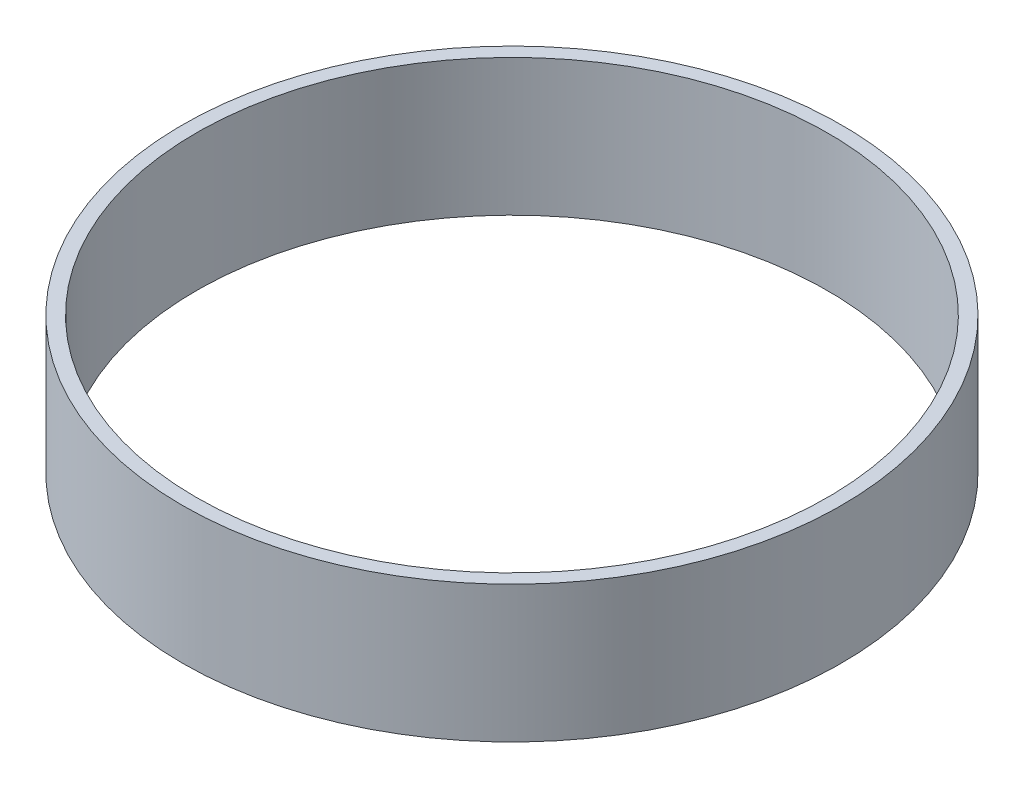
ISO-10303-21;
HEADER;
FILE_DESCRIPTION(('STEP AP214'),'2;1');
FILE_NAME('part.step','',(''),(''),'','','');
FILE_SCHEMA(('AUTOMOTIVE_DESIGN { 1 0 10303 214 1 1 1 1 }'));
ENDSEC;
DATA;
#1=APPLICATION_CONTEXT('core data for automotive mechanical design processes');
#2=APPLICATION_PROTOCOL_DEFINITION('international standard','automotive_design',2000,#1);
#3=PRODUCT_CONTEXT('',#1,'mechanical');
#4=PRODUCT('Part','Part','',(#3));
#5=PRODUCT_RELATED_PRODUCT_CATEGORY('part','',(#4));
#6=PRODUCT_DEFINITION_FORMATION('','',#4);
#7=PRODUCT_DEFINITION_CONTEXT('part definition',#1,'design');
#8=PRODUCT_DEFINITION('design','',#6,#7);
#9=PRODUCT_DEFINITION_SHAPE('','',#8);
#10=(LENGTH_UNIT() NAMED_UNIT(*) SI_UNIT(.MILLI.,.METRE.));
#11=(NAMED_UNIT(*) PLANE_ANGLE_UNIT() SI_UNIT($,.RADIAN.));
#12=(NAMED_UNIT(*) SI_UNIT($,.STERADIAN.) SOLID_ANGLE_UNIT());
#13=UNCERTAINTY_MEASURE_WITH_UNIT(LENGTH_MEASURE(1.E-05),#10,'distance_accuracy_value','');
#14=(GEOMETRIC_REPRESENTATION_CONTEXT(3) GLOBAL_UNCERTAINTY_ASSIGNED_CONTEXT((#13)) GLOBAL_UNIT_ASSIGNED_CONTEXT((#10,
#11,#12)) REPRESENTATION_CONTEXT('',''));
#15=CARTESIAN_POINT('',(0.,0.,0.));
#16=DIRECTION('',(0.,0.,1.));
#17=DIRECTION('',(1.,0.,0.));
#18=AXIS2_PLACEMENT_3D('',#15,#16,#17);
#19=CARTESIAN_POINT('',(-29.4584727390338,10.,1.69765412213674));
#20=DIRECTION('',(0.,1.,0.));
#21=DIRECTION('',(0.,0.,1.));
#22=AXIS2_PLACEMENT_3D('',#19,#20,#21);
#23=PLANE('',#22);
#24=CARTESIAN_POINT('',(-29.4584727390338,10.,1.69765412213674));
#25=DIRECTION('',(0.,1.,0.));
#26=DIRECTION('',(0.,0.,1.));
#27=AXIS2_PLACEMENT_3D('',#24,#25,#26);
#28=CIRCLE('',#27,24.116);
#29=CARTESIAN_POINT('',(-29.4584727390338,10.,25.8136541221367));
#30=VERTEX_POINT('',#29);
#31=EDGE_CURVE('E10',#30,#30,#28,.T.);
#32=ORIENTED_EDGE('',*,*,#31,.T.);
#33=EDGE_LOOP('',(#32));
#34=FACE_BOUND('',#33,.T.);
#35=CARTESIAN_POINT('',(-29.4584727390338,10.,1.69765412213674));
#36=DIRECTION('',(0.,1.,0.));
#37=DIRECTION('',(0.,0.,1.));
#38=AXIS2_PLACEMENT_3D('',#35,#36,#37);
#39=CIRCLE('',#38,23.1);
#40=CARTESIAN_POINT('',(-29.4584727390338,10.,24.7976541221367));
#41=VERTEX_POINT('',#40);
#42=EDGE_CURVE('E41',#41,#41,#39,.T.);
#43=ORIENTED_EDGE('',*,*,#42,.F.);
#44=EDGE_LOOP('',(#43));
#45=FACE_BOUND('',#44,.T.);
#46=ADVANCED_FACE('F30',(#34,#45),#23,.T.);
#47=CARTESIAN_POINT('',(-29.4584727390338,0.,1.69765412213674));
#48=DIRECTION('',(0.,1.,0.));
#49=DIRECTION('',(0.,0.,1.));
#50=AXIS2_PLACEMENT_3D('',#47,#48,#49);
#51=PLANE('',#50);
#52=CARTESIAN_POINT('',(-29.4584727390338,0.,1.69765412213674));
#53=DIRECTION('',(0.,1.,0.));
#54=DIRECTION('',(0.,0.,1.));
#55=AXIS2_PLACEMENT_3D('',#52,#53,#54);
#56=CIRCLE('',#55,24.116);
#57=CARTESIAN_POINT('',(-29.4584727390338,0.,25.8136541221367));
#58=VERTEX_POINT('',#57);
#59=EDGE_CURVE('E34',#58,#58,#56,.T.);
#60=ORIENTED_EDGE('',*,*,#59,.F.);
#61=EDGE_LOOP('',(#60));
#62=FACE_BOUND('',#61,.T.);
#63=CARTESIAN_POINT('',(-29.4584727390338,0.,1.69765412213674));
#64=DIRECTION('',(0.,1.,0.));
#65=DIRECTION('',(0.,0.,1.));
#66=AXIS2_PLACEMENT_3D('',#63,#64,#65);
#67=CIRCLE('',#66,23.1);
#68=CARTESIAN_POINT('',(-29.4584727390338,0.,24.7976541221367));
#69=VERTEX_POINT('',#68);
#70=EDGE_CURVE('E43',#69,#69,#67,.T.);
#71=ORIENTED_EDGE('',*,*,#70,.T.);
#72=EDGE_LOOP('',(#71));
#73=FACE_BOUND('',#72,.T.);
#74=ADVANCED_FACE('F53',(#62,#73),#51,.F.);
#75=CARTESIAN_POINT('',(-29.4584727390338,10.,1.69765412213674));
#76=DIRECTION('',(0.,-1.,0.));
#77=DIRECTION('',(0.,0.,-1.));
#78=AXIS2_PLACEMENT_3D('',#75,#76,#77);
#79=CYLINDRICAL_SURFACE('',#78,24.116);
#80=ORIENTED_EDGE('',*,*,#31,.F.);
#81=EDGE_LOOP('',(#80));
#82=FACE_BOUND('',#81,.T.);
#83=ORIENTED_EDGE('',*,*,#59,.T.);
#84=EDGE_LOOP('',(#83));
#85=FACE_BOUND('',#84,.T.);
#86=ADVANCED_FACE('F32',(#82,#85),#79,.T.);
#87=CARTESIAN_POINT('',(-29.4584727390338,10.,1.69765412213674));
#88=DIRECTION('',(0.,-1.,0.));
#89=DIRECTION('',(0.,0.,-1.));
#90=AXIS2_PLACEMENT_3D('',#87,#88,#89);
#91=CYLINDRICAL_SURFACE('',#90,23.1);
#92=ORIENTED_EDGE('',*,*,#42,.T.);
#93=EDGE_LOOP('',(#92));
#94=FACE_BOUND('',#93,.T.);
#95=ORIENTED_EDGE('',*,*,#70,.F.);
#96=EDGE_LOOP('',(#95));
#97=FACE_BOUND('',#96,.T.);
#98=ADVANCED_FACE('F49',(#94,#97),#91,.F.);
#99=CLOSED_SHELL('',(#46,#74,#86,#98));
#100=MANIFOLD_SOLID_BREP('B2',#99);
#101=ADVANCED_BREP_SHAPE_REPRESENTATION('',(#18,#100),#14);
#102=SHAPE_DEFINITION_REPRESENTATION(#9,#101);
ENDSEC;
END-ISO-10303-21;
